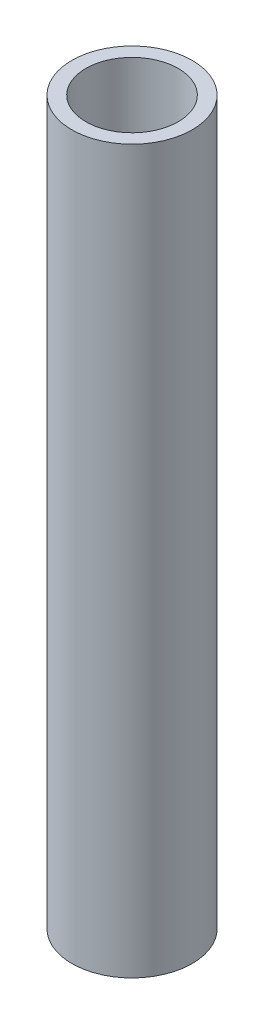
ISO-10303-21;
HEADER;
FILE_DESCRIPTION(('STEP AP214'),'2;1');
FILE_NAME('part.step','',(''),(''),'','','');
FILE_SCHEMA(('AUTOMOTIVE_DESIGN { 1 0 10303 214 1 1 1 1 }'));
ENDSEC;
DATA;
#1=APPLICATION_CONTEXT('core data for automotive mechanical design processes');
#2=APPLICATION_PROTOCOL_DEFINITION('international standard','automotive_design',2000,#1);
#3=PRODUCT_CONTEXT('',#1,'mechanical');
#4=PRODUCT('Part','Part','',(#3));
#5=PRODUCT_RELATED_PRODUCT_CATEGORY('part','',(#4));
#6=PRODUCT_DEFINITION_FORMATION('','',#4);
#7=PRODUCT_DEFINITION_CONTEXT('part definition',#1,'design');
#8=PRODUCT_DEFINITION('design','',#6,#7);
#9=PRODUCT_DEFINITION_SHAPE('','',#8);
#10=(LENGTH_UNIT() NAMED_UNIT(*) SI_UNIT(.MILLI.,.METRE.));
#11=(NAMED_UNIT(*) PLANE_ANGLE_UNIT() SI_UNIT($,.RADIAN.));
#12=(NAMED_UNIT(*) SI_UNIT($,.STERADIAN.) SOLID_ANGLE_UNIT());
#13=UNCERTAINTY_MEASURE_WITH_UNIT(LENGTH_MEASURE(1.E-05),#10,'distance_accuracy_value','');
#14=(GEOMETRIC_REPRESENTATION_CONTEXT(3) GLOBAL_UNCERTAINTY_ASSIGNED_CONTEXT((#13)) GLOBAL_UNIT_ASSIGNED_CONTEXT((#10,
#11,#12)) REPRESENTATION_CONTEXT('',''));
#15=CARTESIAN_POINT('',(0.,0.,0.));
#16=DIRECTION('',(0.,0.,1.));
#17=DIRECTION('',(1.,0.,0.));
#18=AXIS2_PLACEMENT_3D('',#15,#16,#17);
#19=CARTESIAN_POINT('',(0.,76.2,0.));
#20=DIRECTION('',(0.,1.,0.));
#21=DIRECTION('',(0.,0.,1.));
#22=AXIS2_PLACEMENT_3D('',#19,#20,#21);
#23=PLANE('',#22);
#24=CARTESIAN_POINT('',(0.,76.2,0.));
#25=DIRECTION('',(0.,1.,0.));
#26=DIRECTION('',(0.,0.,1.));
#27=AXIS2_PLACEMENT_3D('',#24,#25,#26);
#28=CIRCLE('',#27,6.35);
#29=CARTESIAN_POINT('',(0.,76.2,-6.35));
#30=VERTEX_POINT('',#29);
#31=EDGE_CURVE('E10',#30,#30,#28,.T.);
#32=ORIENTED_EDGE('',*,*,#31,.T.);
#33=EDGE_LOOP('',(#32));
#34=FACE_BOUND('',#33,.T.);
#35=CARTESIAN_POINT('',(0.,76.2,0.));
#36=DIRECTION('',(0.,1.,0.));
#37=DIRECTION('',(0.,0.,1.));
#38=AXIS2_PLACEMENT_3D('',#35,#36,#37);
#39=CIRCLE('',#38,4.8768);
#40=CARTESIAN_POINT('',(0.,76.2,-4.8768));
#41=VERTEX_POINT('',#40);
#42=EDGE_CURVE('E42',#41,#41,#39,.T.);
#43=ORIENTED_EDGE('',*,*,#42,.F.);
#44=EDGE_LOOP('',(#43));
#45=FACE_BOUND('',#44,.T.);
#46=ADVANCED_FACE('F31',(#34,#45),#23,.T.);
#47=CARTESIAN_POINT('',(0.,0.,0.));
#48=DIRECTION('',(0.,1.,0.));
#49=DIRECTION('',(0.,0.,1.));
#50=AXIS2_PLACEMENT_3D('',#47,#48,#49);
#51=PLANE('',#50);
#52=CARTESIAN_POINT('',(0.,0.,0.));
#53=DIRECTION('',(0.,1.,0.));
#54=DIRECTION('',(0.,0.,1.));
#55=AXIS2_PLACEMENT_3D('',#52,#53,#54);
#56=CIRCLE('',#55,6.35);
#57=CARTESIAN_POINT('',(0.,0.,-6.35));
#58=VERTEX_POINT('',#57);
#59=EDGE_CURVE('E35',#58,#58,#56,.T.);
#60=ORIENTED_EDGE('',*,*,#59,.F.);
#61=EDGE_LOOP('',(#60));
#62=FACE_BOUND('',#61,.T.);
#63=CARTESIAN_POINT('',(0.,0.,0.));
#64=DIRECTION('',(0.,1.,0.));
#65=DIRECTION('',(0.,0.,1.));
#66=AXIS2_PLACEMENT_3D('',#63,#64,#65);
#67=CIRCLE('',#66,4.8768);
#68=CARTESIAN_POINT('',(0.,0.,-4.8768));
#69=VERTEX_POINT('',#68);
#70=EDGE_CURVE('E44',#69,#69,#67,.T.);
#71=ORIENTED_EDGE('',*,*,#70,.T.);
#72=EDGE_LOOP('',(#71));
#73=FACE_BOUND('',#72,.T.);
#74=ADVANCED_FACE('F54',(#62,#73),#51,.F.);
#75=CARTESIAN_POINT('',(0.,76.2,0.));
#76=DIRECTION('',(0.,-1.,0.));
#77=DIRECTION('',(0.,0.,-1.));
#78=AXIS2_PLACEMENT_3D('',#75,#76,#77);
#79=CYLINDRICAL_SURFACE('',#78,6.35);
#80=CARTESIAN_POINT('',(0.,76.2,-6.35));
#81=CARTESIAN_POINT('',(0.,75.40625,-6.35));
#82=CARTESIAN_POINT('',(0.,74.6125,-6.35));
#83=CARTESIAN_POINT('',(0.,73.025,-6.35));
#84=CARTESIAN_POINT('',(0.,72.23125,-6.35));
#85=CARTESIAN_POINT('',(0.,70.64375,-6.35));
#86=CARTESIAN_POINT('',(0.,69.85,-6.35));
#87=CARTESIAN_POINT('',(0.,68.2625,-6.35));
#88=CARTESIAN_POINT('',(0.,67.46875,-6.35));
#89=CARTESIAN_POINT('',(0.,65.88125,-6.35));
#90=CARTESIAN_POINT('',(0.,65.0875,-6.35));
#91=CARTESIAN_POINT('',(0.,63.5,-6.35));
#92=CARTESIAN_POINT('',(0.,62.70625,-6.35));
#93=CARTESIAN_POINT('',(0.,61.11875,-6.35));
#94=CARTESIAN_POINT('',(0.,60.325,-6.35));
#95=CARTESIAN_POINT('',(0.,58.7375,-6.35));
#96=CARTESIAN_POINT('',(0.,57.94375,-6.35));
#97=CARTESIAN_POINT('',(0.,56.35625,-6.35));
#98=CARTESIAN_POINT('',(0.,55.5625,-6.35));
#99=CARTESIAN_POINT('',(0.,53.975,-6.35));
#100=CARTESIAN_POINT('',(0.,53.18125,-6.35));
#101=CARTESIAN_POINT('',(0.,51.59375,-6.35));
#102=CARTESIAN_POINT('',(0.,50.8,-6.35));
#103=CARTESIAN_POINT('',(0.,49.2125,-6.35));
#104=CARTESIAN_POINT('',(0.,48.41875,-6.35));
#105=CARTESIAN_POINT('',(0.,46.83125,-6.35));
#106=CARTESIAN_POINT('',(0.,46.0375,-6.35));
#107=CARTESIAN_POINT('',(0.,44.45,-6.35));
#108=CARTESIAN_POINT('',(0.,43.65625,-6.35));
#109=CARTESIAN_POINT('',(0.,42.06875,-6.35));
#110=CARTESIAN_POINT('',(0.,41.275,-6.35));
#111=CARTESIAN_POINT('',(0.,39.6875,-6.35));
#112=CARTESIAN_POINT('',(0.,38.89375,-6.35));
#113=CARTESIAN_POINT('',(0.,37.30625,-6.35));
#114=CARTESIAN_POINT('',(0.,36.5125,-6.35));
#115=CARTESIAN_POINT('',(0.,34.925,-6.35));
#116=CARTESIAN_POINT('',(0.,34.13125,-6.35));
#117=CARTESIAN_POINT('',(0.,32.54375,-6.35));
#118=CARTESIAN_POINT('',(0.,31.75,-6.35));
#119=CARTESIAN_POINT('',(0.,30.1625,-6.35));
#120=CARTESIAN_POINT('',(0.,29.36875,-6.35));
#121=CARTESIAN_POINT('',(0.,27.78125,-6.35));
#122=CARTESIAN_POINT('',(0.,26.9875,-6.35));
#123=CARTESIAN_POINT('',(0.,25.4,-6.35));
#124=CARTESIAN_POINT('',(0.,24.60625,-6.35));
#125=CARTESIAN_POINT('',(0.,23.01875,-6.35));
#126=CARTESIAN_POINT('',(0.,22.225,-6.35));
#127=CARTESIAN_POINT('',(0.,20.6375,-6.35));
#128=CARTESIAN_POINT('',(0.,19.84375,-6.35));
#129=CARTESIAN_POINT('',(0.,18.25625,-6.35));
#130=CARTESIAN_POINT('',(0.,17.4625,-6.35));
#131=CARTESIAN_POINT('',(0.,15.875,-6.35));
#132=CARTESIAN_POINT('',(0.,15.08125,-6.35));
#133=CARTESIAN_POINT('',(0.,13.49375,-6.35));
#134=CARTESIAN_POINT('',(0.,12.7,-6.35));
#135=CARTESIAN_POINT('',(0.,11.1125,-6.35));
#136=CARTESIAN_POINT('',(0.,10.31875,-6.35));
#137=CARTESIAN_POINT('',(0.,8.73125,-6.35));
#138=CARTESIAN_POINT('',(0.,7.93750000000001,-6.35));
#139=CARTESIAN_POINT('',(0.,6.35,-6.35));
#140=CARTESIAN_POINT('',(0.,5.55625,-6.35));
#141=CARTESIAN_POINT('',(0.,3.96875,-6.35));
#142=CARTESIAN_POINT('',(0.,3.175,-6.35));
#143=CARTESIAN_POINT('',(0.,1.5875,-6.35));
#144=CARTESIAN_POINT('',(0.,0.793750000000001,-6.35));
#145=CARTESIAN_POINT('',(0.,0.,-6.35));
#146=B_SPLINE_CURVE_WITH_KNOTS('',3,(#80,#81,#82,#83,#84,#85,#86,#87,#88,#89,#90,#91,#92,#93,
#94,#95,#96,#97,#98,#99,#100,#101,#102,#103,#104,#105,#106,#107,#108,#109,#110,#111,#112,#113,
#114,#115,#116,#117,#118,#119,#120,#121,#122,#123,#124,#125,#126,#127,#128,#129,#130,#131,#132,
#133,#134,#135,#136,#137,#138,#139,#140,#141,#142,#143,#144,#145),.UNSPECIFIED.,.F.,.F.,(4,2,2,
2,2,2,2,2,2,2,2,2,2,2,2,2,2,2,2,2,2,2,2,2,2,2,2,2,2,2,2,2,4),(0.,2.38124999999999,
4.76249999999999,7.14374999999999,9.52499999999999,11.90625,14.2875,16.66875,19.05,21.43125,
23.8125,26.19375,28.575,30.95625,33.3375,35.71875,38.1,40.48125,42.8625,45.24375,47.625,
50.00625,52.3875,54.76875,57.15,59.53125,61.9125,64.29375,66.675,69.05625,71.4375,73.81875,
76.2),.UNSPECIFIED.);
#147=EDGE_CURVE('BSEAM33',#30,#58,#146,.T.);
#148=ORIENTED_EDGE('',*,*,#31,.F.);
#149=ORIENTED_EDGE('',*,*,#59,.T.);
#150=ORIENTED_EDGE('',*,*,#147,.T.);
#151=ORIENTED_EDGE('',*,*,#147,.F.);
#152=EDGE_LOOP('',(#148,#150,#149,#151));
#153=FACE_BOUND('',#152,.T.);
#154=ADVANCED_FACE('F33',(#153),#79,.T.);
#155=CARTESIAN_POINT('',(0.,76.2,0.));
#156=DIRECTION('',(0.,-1.,0.));
#157=DIRECTION('',(0.,0.,-1.));
#158=AXIS2_PLACEMENT_3D('',#155,#156,#157);
#159=CYLINDRICAL_SURFACE('',#158,4.8768);
#160=CARTESIAN_POINT('',(0.,76.2,-4.8768));
#161=CARTESIAN_POINT('',(0.,75.40625,-4.8768));
#162=CARTESIAN_POINT('',(0.,74.6125,-4.8768));
#163=CARTESIAN_POINT('',(0.,73.025,-4.8768));
#164=CARTESIAN_POINT('',(0.,72.23125,-4.8768));
#165=CARTESIAN_POINT('',(0.,70.64375,-4.8768));
#166=CARTESIAN_POINT('',(0.,69.85,-4.8768));
#167=CARTESIAN_POINT('',(0.,68.2625,-4.8768));
#168=CARTESIAN_POINT('',(0.,67.46875,-4.8768));
#169=CARTESIAN_POINT('',(0.,65.88125,-4.8768));
#170=CARTESIAN_POINT('',(0.,65.0875,-4.8768));
#171=CARTESIAN_POINT('',(0.,63.5,-4.8768));
#172=CARTESIAN_POINT('',(0.,62.70625,-4.8768));
#173=CARTESIAN_POINT('',(0.,61.11875,-4.8768));
#174=CARTESIAN_POINT('',(0.,60.325,-4.8768));
#175=CARTESIAN_POINT('',(0.,58.7375,-4.8768));
#176=CARTESIAN_POINT('',(0.,57.94375,-4.8768));
#177=CARTESIAN_POINT('',(0.,56.35625,-4.8768));
#178=CARTESIAN_POINT('',(0.,55.5625,-4.8768));
#179=CARTESIAN_POINT('',(0.,53.975,-4.8768));
#180=CARTESIAN_POINT('',(0.,53.18125,-4.8768));
#181=CARTESIAN_POINT('',(0.,51.59375,-4.8768));
#182=CARTESIAN_POINT('',(0.,50.8,-4.8768));
#183=CARTESIAN_POINT('',(0.,49.2125,-4.8768));
#184=CARTESIAN_POINT('',(0.,48.41875,-4.8768));
#185=CARTESIAN_POINT('',(0.,46.83125,-4.8768));
#186=CARTESIAN_POINT('',(0.,46.0375,-4.8768));
#187=CARTESIAN_POINT('',(0.,44.45,-4.8768));
#188=CARTESIAN_POINT('',(0.,43.65625,-4.8768));
#189=CARTESIAN_POINT('',(0.,42.06875,-4.8768));
#190=CARTESIAN_POINT('',(0.,41.275,-4.8768));
#191=CARTESIAN_POINT('',(0.,39.6875,-4.8768));
#192=CARTESIAN_POINT('',(0.,38.89375,-4.8768));
#193=CARTESIAN_POINT('',(0.,37.30625,-4.8768));
#194=CARTESIAN_POINT('',(0.,36.5125,-4.8768));
#195=CARTESIAN_POINT('',(0.,34.925,-4.8768));
#196=CARTESIAN_POINT('',(0.,34.13125,-4.8768));
#197=CARTESIAN_POINT('',(0.,32.54375,-4.8768));
#198=CARTESIAN_POINT('',(0.,31.75,-4.8768));
#199=CARTESIAN_POINT('',(0.,30.1625,-4.8768));
#200=CARTESIAN_POINT('',(0.,29.36875,-4.8768));
#201=CARTESIAN_POINT('',(0.,27.78125,-4.8768));
#202=CARTESIAN_POINT('',(0.,26.9875,-4.8768));
#203=CARTESIAN_POINT('',(0.,25.4,-4.8768));
#204=CARTESIAN_POINT('',(0.,24.60625,-4.8768));
#205=CARTESIAN_POINT('',(0.,23.01875,-4.8768));
#206=CARTESIAN_POINT('',(0.,22.225,-4.8768));
#207=CARTESIAN_POINT('',(0.,20.6375,-4.8768));
#208=CARTESIAN_POINT('',(0.,19.84375,-4.8768));
#209=CARTESIAN_POINT('',(0.,18.25625,-4.8768));
#210=CARTESIAN_POINT('',(0.,17.4625,-4.8768));
#211=CARTESIAN_POINT('',(0.,15.875,-4.8768));
#212=CARTESIAN_POINT('',(0.,15.08125,-4.8768));
#213=CARTESIAN_POINT('',(0.,13.49375,-4.8768));
#214=CARTESIAN_POINT('',(0.,12.7,-4.8768));
#215=CARTESIAN_POINT('',(0.,11.1125,-4.8768));
#216=CARTESIAN_POINT('',(0.,10.31875,-4.8768));
#217=CARTESIAN_POINT('',(0.,8.73125,-4.8768));
#218=CARTESIAN_POINT('',(0.,7.93750000000001,-4.8768));
#219=CARTESIAN_POINT('',(0.,6.35,-4.8768));
#220=CARTESIAN_POINT('',(0.,5.55625,-4.8768));
#221=CARTESIAN_POINT('',(0.,3.96875,-4.8768));
#222=CARTESIAN_POINT('',(0.,3.175,-4.8768));
#223=CARTESIAN_POINT('',(0.,1.5875,-4.8768));
#224=CARTESIAN_POINT('',(0.,0.793750000000001,-4.8768));
#225=CARTESIAN_POINT('',(0.,0.,-4.8768));
#226=B_SPLINE_CURVE_WITH_KNOTS('',3,(#160,#161,#162,#163,#164,#165,#166,#167,#168,#169,#170,
#171,#172,#173,#174,#175,#176,#177,#178,#179,#180,#181,#182,#183,#184,#185,#186,#187,#188,#189,
#190,#191,#192,#193,#194,#195,#196,#197,#198,#199,#200,#201,#202,#203,#204,#205,#206,#207,#208,
#209,#210,#211,#212,#213,#214,#215,#216,#217,#218,#219,#220,#221,#222,#223,#224,#225),
.UNSPECIFIED.,.F.,.F.,(4,2,2,2,2,2,2,2,2,2,2,2,2,2,2,2,2,2,2,2,2,2,2,2,2,2,2,2,2,2,2,2,4),(0.,
2.38125,4.7625,7.14375,9.52500000000001,11.90625,14.2875,16.66875,19.05,21.43125,23.8125,
26.19375,28.575,30.95625,33.3375,35.71875,38.1,40.48125,42.8625,45.24375,47.625,50.00625,
52.3875,54.76875,57.15,59.53125,61.9125,64.29375,66.675,69.05625,71.4375,73.81875,76.2),.UNSPECIFIED.);
#227=EDGE_CURVE('BSEAM50',#41,#69,#226,.T.);
#228=ORIENTED_EDGE('',*,*,#42,.T.);
#229=ORIENTED_EDGE('',*,*,#70,.F.);
#230=ORIENTED_EDGE('',*,*,#227,.T.);
#231=ORIENTED_EDGE('',*,*,#227,.F.);
#232=EDGE_LOOP('',(#228,#230,#229,#231));
#233=FACE_BOUND('',#232,.T.);
#234=ADVANCED_FACE('F50',(#233),#159,.F.);
#235=CLOSED_SHELL('',(#46,#74,#154,#234));
#236=MANIFOLD_SOLID_BREP('B2',#235);
#237=ADVANCED_BREP_SHAPE_REPRESENTATION('',(#18,#236),#14);
#238=SHAPE_DEFINITION_REPRESENTATION(#9,#237);
ENDSEC;
END-ISO-10303-21;
